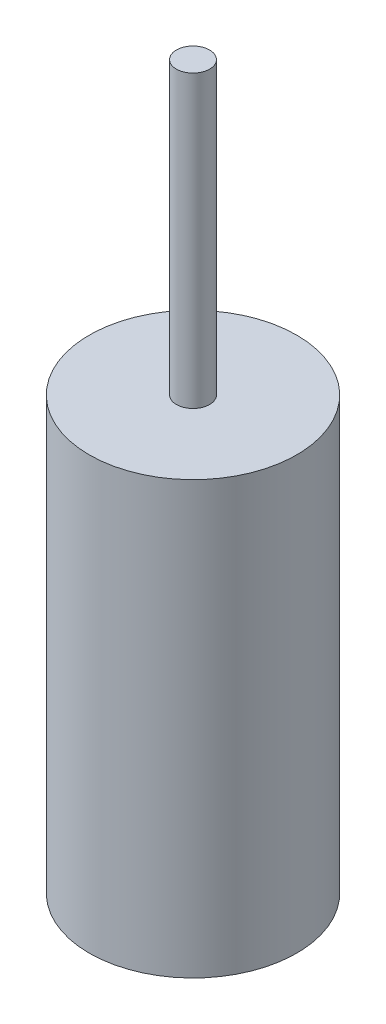
ISO-10303-21;
HEADER;
FILE_DESCRIPTION(('STEP AP214'),'2;1');
FILE_NAME('part.step','',(''),(''),'','','');
FILE_SCHEMA(('AUTOMOTIVE_DESIGN { 1 0 10303 214 1 1 1 1 }'));
ENDSEC;
DATA;
#1=APPLICATION_CONTEXT('core data for automotive mechanical design processes');
#2=APPLICATION_PROTOCOL_DEFINITION('international standard','automotive_design',2000,#1);
#3=PRODUCT_CONTEXT('',#1,'mechanical');
#4=PRODUCT('Part','Part','',(#3));
#5=PRODUCT_RELATED_PRODUCT_CATEGORY('part','',(#4));
#6=PRODUCT_DEFINITION_FORMATION('','',#4);
#7=PRODUCT_DEFINITION_CONTEXT('part definition',#1,'design');
#8=PRODUCT_DEFINITION('design','',#6,#7);
#9=PRODUCT_DEFINITION_SHAPE('','',#8);
#10=(LENGTH_UNIT() NAMED_UNIT(*) SI_UNIT(.MILLI.,.METRE.));
#11=(NAMED_UNIT(*) PLANE_ANGLE_UNIT() SI_UNIT($,.RADIAN.));
#12=(NAMED_UNIT(*) SI_UNIT($,.STERADIAN.) SOLID_ANGLE_UNIT());
#13=UNCERTAINTY_MEASURE_WITH_UNIT(LENGTH_MEASURE(1.E-05),#10,'distance_accuracy_value','');
#14=(GEOMETRIC_REPRESENTATION_CONTEXT(3) GLOBAL_UNCERTAINTY_ASSIGNED_CONTEXT((#13)) GLOBAL_UNIT_ASSIGNED_CONTEXT((#10,
#11,#12)) REPRESENTATION_CONTEXT('',''));
#15=CARTESIAN_POINT('',(0.,0.,0.));
#16=DIRECTION('',(0.,0.,1.));
#17=DIRECTION('',(1.,0.,0.));
#18=AXIS2_PLACEMENT_3D('',#15,#16,#17);
#19=CARTESIAN_POINT('',(0.,52.,0.));
#20=DIRECTION('',(0.,-1.,0.));
#21=DIRECTION('',(0.,0.,-1.));
#22=AXIS2_PLACEMENT_3D('',#19,#20,#21);
#23=CYLINDRICAL_SURFACE('',#22,12.5);
#24=CARTESIAN_POINT('',(0.,52.,0.));
#25=DIRECTION('',(0.,1.,0.));
#26=DIRECTION('',(0.,0.,1.));
#27=AXIS2_PLACEMENT_3D('',#24,#25,#26);
#28=CIRCLE('',#27,12.5);
#29=CARTESIAN_POINT('',(0.,52.,-12.5));
#30=VERTEX_POINT('',#29);
#31=EDGE_CURVE('E10',#30,#30,#28,.T.);
#32=CARTESIAN_POINT('',(0.,0.,0.));
#33=DIRECTION('',(0.,1.,0.));
#34=DIRECTION('',(0.,0.,1.));
#35=AXIS2_PLACEMENT_3D('',#32,#33,#34);
#36=CIRCLE('',#35,12.5);
#37=CARTESIAN_POINT('',(0.,0.,-12.5));
#38=VERTEX_POINT('',#37);
#39=EDGE_CURVE('E33',#38,#38,#36,.T.);
#40=CARTESIAN_POINT('',(0.,52.,-12.5));
#41=CARTESIAN_POINT('',(0.,51.4583333333333,-12.5));
#42=CARTESIAN_POINT('',(0.,50.9166666666667,-12.5));
#43=CARTESIAN_POINT('',(0.,49.8333333333333,-12.5));
#44=CARTESIAN_POINT('',(0.,49.2916666666667,-12.5));
#45=CARTESIAN_POINT('',(0.,48.2083333333333,-12.5));
#46=CARTESIAN_POINT('',(0.,47.6666666666667,-12.5));
#47=CARTESIAN_POINT('',(0.,46.5833333333333,-12.5));
#48=CARTESIAN_POINT('',(0.,46.0416666666667,-12.5));
#49=CARTESIAN_POINT('',(0.,44.9583333333333,-12.5));
#50=CARTESIAN_POINT('',(0.,44.4166666666667,-12.5));
#51=CARTESIAN_POINT('',(0.,43.3333333333333,-12.5));
#52=CARTESIAN_POINT('',(0.,42.7916666666667,-12.5));
#53=CARTESIAN_POINT('',(0.,41.7083333333333,-12.5));
#54=CARTESIAN_POINT('',(0.,41.1666666666667,-12.5));
#55=CARTESIAN_POINT('',(0.,40.0833333333333,-12.5));
#56=CARTESIAN_POINT('',(0.,39.5416666666667,-12.5));
#57=CARTESIAN_POINT('',(0.,38.4583333333333,-12.5));
#58=CARTESIAN_POINT('',(0.,37.9166666666667,-12.5));
#59=CARTESIAN_POINT('',(0.,36.8333333333333,-12.5));
#60=CARTESIAN_POINT('',(0.,36.2916666666667,-12.5));
#61=CARTESIAN_POINT('',(0.,35.2083333333333,-12.5));
#62=CARTESIAN_POINT('',(0.,34.6666666666667,-12.5));
#63=CARTESIAN_POINT('',(0.,33.5833333333333,-12.5));
#64=CARTESIAN_POINT('',(0.,33.0416666666667,-12.5));
#65=CARTESIAN_POINT('',(0.,31.9583333333333,-12.5));
#66=CARTESIAN_POINT('',(0.,31.4166666666667,-12.5));
#67=CARTESIAN_POINT('',(0.,30.3333333333333,-12.5));
#68=CARTESIAN_POINT('',(0.,29.7916666666667,-12.5));
#69=CARTESIAN_POINT('',(0.,28.7083333333333,-12.5));
#70=CARTESIAN_POINT('',(0.,28.1666666666667,-12.5));
#71=CARTESIAN_POINT('',(0.,27.0833333333333,-12.5));
#72=CARTESIAN_POINT('',(0.,26.5416666666667,-12.5));
#73=CARTESIAN_POINT('',(0.,25.4583333333333,-12.5));
#74=CARTESIAN_POINT('',(0.,24.9166666666667,-12.5));
#75=CARTESIAN_POINT('',(0.,23.8333333333333,-12.5));
#76=CARTESIAN_POINT('',(0.,23.2916666666667,-12.5));
#77=CARTESIAN_POINT('',(0.,22.2083333333333,-12.5));
#78=CARTESIAN_POINT('',(0.,21.6666666666667,-12.5));
#79=CARTESIAN_POINT('',(0.,20.5833333333333,-12.5));
#80=CARTESIAN_POINT('',(0.,20.0416666666667,-12.5));
#81=CARTESIAN_POINT('',(0.,18.9583333333333,-12.5));
#82=CARTESIAN_POINT('',(0.,18.4166666666667,-12.5));
#83=CARTESIAN_POINT('',(0.,17.3333333333333,-12.5));
#84=CARTESIAN_POINT('',(0.,16.7916666666667,-12.5));
#85=CARTESIAN_POINT('',(0.,15.7083333333333,-12.5));
#86=CARTESIAN_POINT('',(0.,15.1666666666667,-12.5));
#87=CARTESIAN_POINT('',(0.,14.0833333333333,-12.5));
#88=CARTESIAN_POINT('',(0.,13.5416666666667,-12.5));
#89=CARTESIAN_POINT('',(0.,12.4583333333333,-12.5));
#90=CARTESIAN_POINT('',(0.,11.9166666666667,-12.5));
#91=CARTESIAN_POINT('',(0.,10.8333333333333,-12.5));
#92=CARTESIAN_POINT('',(0.,10.2916666666667,-12.5));
#93=CARTESIAN_POINT('',(0.,9.20833333333333,-12.5));
#94=CARTESIAN_POINT('',(0.,8.66666666666667,-12.5));
#95=CARTESIAN_POINT('',(0.,7.58333333333333,-12.5));
#96=CARTESIAN_POINT('',(0.,7.04166666666667,-12.5));
#97=CARTESIAN_POINT('',(0.,5.95833333333333,-12.5));
#98=CARTESIAN_POINT('',(0.,5.41666666666667,-12.5));
#99=CARTESIAN_POINT('',(0.,4.33333333333333,-12.5));
#100=CARTESIAN_POINT('',(0.,3.79166666666667,-12.5));
#101=CARTESIAN_POINT('',(0.,2.70833333333334,-12.5));
#102=CARTESIAN_POINT('',(0.,2.16666666666667,-12.5));
#103=CARTESIAN_POINT('',(0.,1.08333333333333,-12.5));
#104=CARTESIAN_POINT('',(0.,0.541666666666667,-12.5));
#105=CARTESIAN_POINT('',(0.,0.,-12.5));
#106=B_SPLINE_CURVE_WITH_KNOTS('',3,(#40,#41,#42,#43,#44,#45,#46,#47,#48,#49,#50,#51,#52,#53,
#54,#55,#56,#57,#58,#59,#60,#61,#62,#63,#64,#65,#66,#67,#68,#69,#70,#71,#72,#73,#74,#75,#76,#77,
#78,#79,#80,#81,#82,#83,#84,#85,#86,#87,#88,#89,#90,#91,#92,#93,#94,#95,#96,#97,#98,#99,#100,
#101,#102,#103,#104,#105),.UNSPECIFIED.,.F.,.F.,(4,2,2,2,2,2,2,2,2,2,2,2,2,2,2,2,2,2,2,2,2,2,2,
2,2,2,2,2,2,2,2,2,4),(0.,1.625,3.25,4.875,6.50000000000001,8.125,9.75,11.375,13.,14.625,16.25,
17.875,19.5,21.125,22.75,24.375,26.,27.625,29.25,30.875,32.5,34.125,35.75,37.375,39.,40.625,
42.25,43.875,45.5,47.125,48.75,50.375,52.),.UNSPECIFIED.);
#107=EDGE_CURVE('BSEAM30',#30,#38,#106,.T.);
#108=ORIENTED_EDGE('',*,*,#31,.F.);
#109=ORIENTED_EDGE('',*,*,#39,.T.);
#110=ORIENTED_EDGE('',*,*,#107,.T.);
#111=ORIENTED_EDGE('',*,*,#107,.F.);
#112=EDGE_LOOP('',(#108,#110,#109,#111));
#113=FACE_BOUND('',#112,.T.);
#114=ADVANCED_FACE('F30',(#113),#23,.T.);
#115=CARTESIAN_POINT('',(0.,52.,0.));
#116=DIRECTION('',(0.,1.,0.));
#117=DIRECTION('',(0.,0.,1.));
#118=AXIS2_PLACEMENT_3D('',#115,#116,#117);
#119=PLANE('',#118);
#120=CARTESIAN_POINT('',(0.,52.,0.));
#121=DIRECTION('',(0.,1.,0.));
#122=DIRECTION('',(0.,0.,1.));
#123=AXIS2_PLACEMENT_3D('',#120,#121,#122);
#124=CIRCLE('',#123,2.);
#125=CARTESIAN_POINT('',(0.,52.,2.));
#126=VERTEX_POINT('',#125);
#127=EDGE_CURVE('E42',#126,#126,#124,.T.);
#128=ORIENTED_EDGE('',*,*,#127,.F.);
#129=EDGE_LOOP('',(#128));
#130=FACE_BOUND('',#129,.T.);
#131=ORIENTED_EDGE('',*,*,#31,.T.);
#132=EDGE_LOOP('',(#131));
#133=FACE_BOUND('',#132,.T.);
#134=ADVANCED_FACE('F57',(#130,#133),#119,.T.);
#135=CARTESIAN_POINT('',(0.,0.,0.));
#136=DIRECTION('',(0.,1.,0.));
#137=DIRECTION('',(0.,0.,1.));
#138=AXIS2_PLACEMENT_3D('',#135,#136,#137);
#139=PLANE('',#138);
#140=ORIENTED_EDGE('',*,*,#39,.F.);
#141=EDGE_LOOP('',(#140));
#142=FACE_BOUND('',#141,.T.);
#143=ADVANCED_FACE('F53',(#142),#139,.F.);
#144=CARTESIAN_POINT('',(0.,87.,0.));
#145=DIRECTION('',(0.,-1.,0.));
#146=DIRECTION('',(0.,0.,-1.));
#147=AXIS2_PLACEMENT_3D('',#144,#145,#146);
#148=CYLINDRICAL_SURFACE('',#147,2.);
#149=CARTESIAN_POINT('',(0.,87.,0.));
#150=DIRECTION('',(0.,1.,0.));
#151=DIRECTION('',(0.,0.,1.));
#152=AXIS2_PLACEMENT_3D('',#149,#150,#151);
#153=CIRCLE('',#152,2.);
#154=CARTESIAN_POINT('',(0.,87.,2.));
#155=VERTEX_POINT('',#154);
#156=EDGE_CURVE('E40',#155,#155,#153,.T.);
#157=ORIENTED_EDGE('',*,*,#156,.F.);
#158=EDGE_LOOP('',(#157));
#159=FACE_BOUND('',#158,.T.);
#160=ORIENTED_EDGE('',*,*,#127,.T.);
#161=EDGE_LOOP('',(#160));
#162=FACE_BOUND('',#161,.T.);
#163=ADVANCED_FACE('F50',(#159,#162),#148,.T.);
#164=CARTESIAN_POINT('',(0.,87.,0.));
#165=DIRECTION('',(0.,1.,0.));
#166=DIRECTION('',(0.,0.,1.));
#167=AXIS2_PLACEMENT_3D('',#164,#165,#166);
#168=PLANE('',#167);
#169=ORIENTED_EDGE('',*,*,#156,.T.);
#170=EDGE_LOOP('',(#169));
#171=FACE_BOUND('',#170,.T.);
#172=ADVANCED_FACE('F48',(#171),#168,.T.);
#173=CLOSED_SHELL('',(#114,#134,#143,#163,#172));
#174=MANIFOLD_SOLID_BREP('B2',#173);
#175=ADVANCED_BREP_SHAPE_REPRESENTATION('',(#18,#174),#14);
#176=SHAPE_DEFINITION_REPRESENTATION(#9,#175);
ENDSEC;
END-ISO-10303-21;
